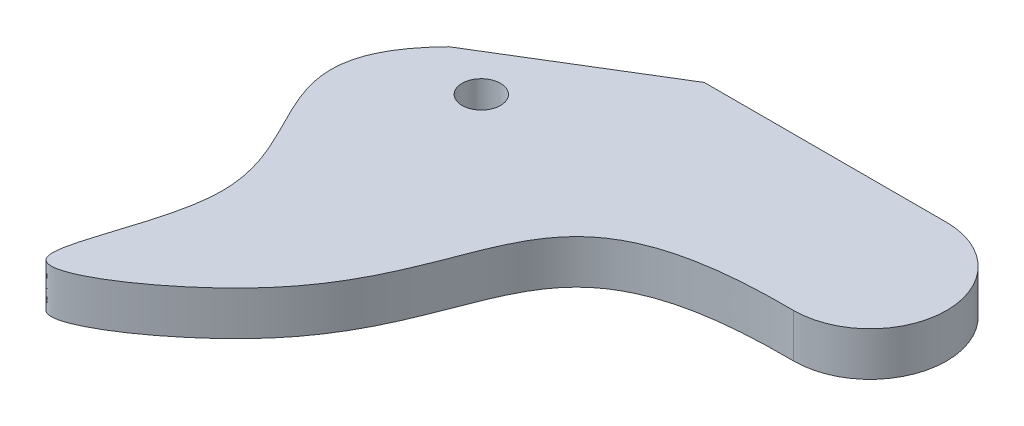
ISO-10303-21;
HEADER;
FILE_DESCRIPTION(('STEP AP214'),'2;1');
FILE_NAME('part.step','',(''),(''),'','','');
FILE_SCHEMA(('AUTOMOTIVE_DESIGN { 1 0 10303 214 1 1 1 1 }'));
ENDSEC;
DATA;
#1=APPLICATION_CONTEXT('core data for automotive mechanical design processes');
#2=APPLICATION_PROTOCOL_DEFINITION('international standard','automotive_design',2000,#1);
#3=PRODUCT_CONTEXT('',#1,'mechanical');
#4=PRODUCT('Part','Part','',(#3));
#5=PRODUCT_RELATED_PRODUCT_CATEGORY('part','',(#4));
#6=PRODUCT_DEFINITION_FORMATION('','',#4);
#7=PRODUCT_DEFINITION_CONTEXT('part definition',#1,'design');
#8=PRODUCT_DEFINITION('design','',#6,#7);
#9=PRODUCT_DEFINITION_SHAPE('','',#8);
#10=(LENGTH_UNIT() NAMED_UNIT(*) SI_UNIT(.MILLI.,.METRE.));
#11=(NAMED_UNIT(*) PLANE_ANGLE_UNIT() SI_UNIT($,.RADIAN.));
#12=(NAMED_UNIT(*) SI_UNIT($,.STERADIAN.) SOLID_ANGLE_UNIT());
#13=UNCERTAINTY_MEASURE_WITH_UNIT(LENGTH_MEASURE(1.E-05),#10,'distance_accuracy_value','');
#14=(GEOMETRIC_REPRESENTATION_CONTEXT(3) GLOBAL_UNCERTAINTY_ASSIGNED_CONTEXT((#13)) GLOBAL_UNIT_ASSIGNED_CONTEXT((#10,
#11,#12)) REPRESENTATION_CONTEXT('',''));
#15=CARTESIAN_POINT('',(0.,0.,0.));
#16=DIRECTION('',(0.,0.,1.));
#17=DIRECTION('',(1.,0.,0.));
#18=AXIS2_PLACEMENT_3D('',#15,#16,#17);
#19=CARTESIAN_POINT('',(-25.8468826698437,4.5,39.8679953100334));
#20=DIRECTION('',(0.,-1.,0.));
#21=DIRECTION('',(0.,0.,-1.));
#22=AXIS2_PLACEMENT_3D('',#19,#20,#21);
#23=PLANE('',#22);
#24=DIRECTION('',(-0.85373785789707,0.,0.52070305356635));
#25=VECTOR('',#24,1.);
#26=CARTESIAN_POINT('',(-13.2289068305966,4.5,-8.03545485670252));
#27=LINE('',#26,#25);
#28=CARTESIAN_POINT('',(-13.2289068305966,4.5,-8.03545485670252));
#29=VERTEX_POINT('',#28);
#30=CARTESIAN_POINT('',(-29.5278018595063,4.5,1.9054003283019));
#31=VERTEX_POINT('',#30);
#32=EDGE_CURVE('E85',#29,#31,#27,.T.);
#33=ORIENTED_EDGE('',*,*,#32,.T.);
#34=CARTESIAN_POINT('',(-29.5278018595063,4.5,1.9054003283019));
#35=CARTESIAN_POINT('',(-39.373883882875,4.5,12.0427063909764));
#36=CARTESIAN_POINT('',(-21.4837938279231,4.5,19.6224952065016));
#37=CARTESIAN_POINT('',(-37.0611534072056,4.5,48.0941578942005));
#38=CARTESIAN_POINT('',(-2.77899188510992,4.5,24.8059677229349));
#39=CARTESIAN_POINT('',(-14.13896958369,4.5,7.37335119843411));
#40=CARTESIAN_POINT('',(11.6530193285,4.5,7.66013429683492));
#41=B_SPLINE_CURVE_WITH_KNOTS('',3,(#34,#35,#36,#37,#38,#39,#40),.UNSPECIFIED.,.F.,.F.,(4,1,1,1,
4),(0.,0.264966168408537,0.418851031726959,0.58712602821493,1.),.UNSPECIFIED.);
#42=CARTESIAN_POINT('',(11.6530193285,4.5,7.66013429683492));
#43=VERTEX_POINT('',#42);
#44=EDGE_CURVE('E80',#31,#43,#41,.T.);
#45=ORIENTED_EDGE('',*,*,#44,.T.);
#46=CARTESIAN_POINT('',(11.6530193285,4.5,-0.1876602799338));
#47=DIRECTION('',(0.,1.,0.));
#48=DIRECTION('',(0.,0.,1.));
#49=AXIS2_PLACEMENT_3D('',#46,#47,#48);
#50=CIRCLE('',#49,7.84779457676872);
#51=CARTESIAN_POINT('',(11.6530193285,4.5,-8.03545485670252));
#52=VERTEX_POINT('',#51);
#53=EDGE_CURVE('E83',#43,#52,#50,.T.);
#54=ORIENTED_EDGE('',*,*,#53,.T.);
#55=DIRECTION('',(-1.,0.,0.));
#56=VECTOR('',#55,1.);
#57=CARTESIAN_POINT('',(-13.2289068305966,4.5,-8.03545485670252));
#58=LINE('',#57,#56);
#59=EDGE_CURVE('E50',#52,#29,#58,.T.);
#60=ORIENTED_EDGE('',*,*,#59,.T.);
#61=EDGE_LOOP('',(#33,#45,#54,#60));
#62=FACE_BOUND('',#61,.T.);
#63=CARTESIAN_POINT('',(-23.6205551146785,4.5,4.47899590226864));
#64=DIRECTION('',(0.,1.,0.));
#65=DIRECTION('',(0.,0.,1.));
#66=AXIS2_PLACEMENT_3D('',#63,#64,#65);
#67=CIRCLE('',#66,1.97500000000001);
#68=CARTESIAN_POINT('',(-23.6205551146785,4.5,6.45399590226865));
#69=VERTEX_POINT('',#68);
#70=EDGE_CURVE('E103',#69,#69,#67,.T.);
#71=ORIENTED_EDGE('',*,*,#70,.F.);
#72=EDGE_LOOP('',(#71));
#73=FACE_BOUND('',#72,.T.);
#74=ADVANCED_FACE('F33',(#62,#73),#23,.F.);
#75=CARTESIAN_POINT('',(-25.8468826698437,0.,39.8679953100334));
#76=DIRECTION('',(0.,-1.,0.));
#77=DIRECTION('',(0.,0.,-1.));
#78=AXIS2_PLACEMENT_3D('',#75,#76,#77);
#79=PLANE('',#78);
#80=DIRECTION('',(-0.85373785789707,0.,0.52070305356635));
#81=VECTOR('',#80,1.);
#82=CARTESIAN_POINT('',(-13.2289068305966,0.,-8.03545485670252));
#83=LINE('',#82,#81);
#84=CARTESIAN_POINT('',(-13.2289068305966,0.,-8.03545485670252));
#85=VERTEX_POINT('',#84);
#86=CARTESIAN_POINT('',(-29.5278018595063,0.,1.9054003283019));
#87=VERTEX_POINT('',#86);
#88=EDGE_CURVE('E100',#85,#87,#83,.T.);
#89=ORIENTED_EDGE('',*,*,#88,.F.);
#90=DIRECTION('',(-1.,0.,0.));
#91=VECTOR('',#90,1.);
#92=CARTESIAN_POINT('',(-13.2289068305966,0.,-8.03545485670252));
#93=LINE('',#92,#91);
#94=CARTESIAN_POINT('',(11.6530193285,0.,-8.03545485670252));
#95=VERTEX_POINT('',#94);
#96=EDGE_CURVE('E73',#95,#85,#93,.T.);
#97=ORIENTED_EDGE('',*,*,#96,.F.);
#98=CARTESIAN_POINT('',(11.6530193285,0.,-0.1876602799338));
#99=DIRECTION('',(0.,1.,0.));
#100=DIRECTION('',(0.,0.,1.));
#101=AXIS2_PLACEMENT_3D('',#98,#99,#100);
#102=CIRCLE('',#101,7.84779457676872);
#103=CARTESIAN_POINT('',(11.6530193285,0.,7.66013429683492));
#104=VERTEX_POINT('',#103);
#105=EDGE_CURVE('E67',#104,#95,#102,.T.);
#106=ORIENTED_EDGE('',*,*,#105,.F.);
#107=CARTESIAN_POINT('',(-29.5278018595063,0.,1.9054003283019));
#108=CARTESIAN_POINT('',(-39.373883882875,0.,12.0427063909764));
#109=CARTESIAN_POINT('',(-21.4837938279231,0.,19.6224952065016));
#110=CARTESIAN_POINT('',(-37.0611534072056,0.,48.0941578942005));
#111=CARTESIAN_POINT('',(-2.77899188510992,0.,24.8059677229349));
#112=CARTESIAN_POINT('',(-14.13896958369,0.,7.37335119843411));
#113=CARTESIAN_POINT('',(11.6530193285,0.,7.66013429683492));
#114=B_SPLINE_CURVE_WITH_KNOTS('',3,(#107,#108,#109,#110,#111,#112,#113),.UNSPECIFIED.,.F.,.F.,
(4,1,1,1,4),(0.,0.264966168408537,0.418851031726959,0.58712602821493,1.),.UNSPECIFIED.);
#115=EDGE_CURVE('E89',#87,#104,#114,.T.);
#116=ORIENTED_EDGE('',*,*,#115,.F.);
#117=EDGE_LOOP('',(#89,#97,#106,#116));
#118=FACE_BOUND('',#117,.T.);
#119=CARTESIAN_POINT('',(-23.6205551146785,0.,4.47899590226864));
#120=DIRECTION('',(0.,1.,0.));
#121=DIRECTION('',(0.,0.,1.));
#122=AXIS2_PLACEMENT_3D('',#119,#120,#121);
#123=CIRCLE('',#122,1.97500000000001);
#124=CARTESIAN_POINT('',(-23.6205551146785,0.,6.45399590226865));
#125=VERTEX_POINT('',#124);
#126=EDGE_CURVE('E120',#125,#125,#123,.T.);
#127=ORIENTED_EDGE('',*,*,#126,.T.);
#128=EDGE_LOOP('',(#127));
#129=FACE_BOUND('',#128,.T.);
#130=ADVANCED_FACE('F116',(#118,#129),#79,.T.);
#131=CARTESIAN_POINT('',(-13.2289068305966,4.5,-8.03545485670252));
#132=DIRECTION('',(0.52070305356635,0.,0.85373785789707));
#133=DIRECTION('',(0.853737857897071,0.,-0.52070305356635));
#134=AXIS2_PLACEMENT_3D('',#131,#132,#133);
#135=PLANE('',#134);
#136=ORIENTED_EDGE('',*,*,#88,.T.);
#137=DIRECTION('',(0.,-1.,0.));
#138=VECTOR('',#137,1.);
#139=CARTESIAN_POINT('',(-29.5278018595063,4.5,1.9054003283019));
#140=LINE('',#139,#138);
#141=EDGE_CURVE('E11',#31,#87,#140,.T.);
#142=ORIENTED_EDGE('',*,*,#141,.F.);
#143=ORIENTED_EDGE('',*,*,#32,.F.);
#144=DIRECTION('',(0.,-1.,0.));
#145=VECTOR('',#144,1.);
#146=CARTESIAN_POINT('',(-13.2289068305966,4.5,-8.03545485670252));
#147=LINE('',#146,#145);
#148=EDGE_CURVE('E93',#29,#85,#147,.T.);
#149=ORIENTED_EDGE('',*,*,#148,.T.);
#150=EDGE_LOOP('',(#136,#142,#143,#149));
#151=FACE_BOUND('',#150,.T.);
#152=ADVANCED_FACE('F35',(#151),#135,.F.);
#153=DIRECTION('',(0.,-1.,0.));
#154=VECTOR('',#153,1.);
#155=SURFACE_OF_LINEAR_EXTRUSION('',#41,#154);
#156=ORIENTED_EDGE('',*,*,#115,.T.);
#157=DIRECTION('',(0.,-1.,0.));
#158=VECTOR('',#157,1.);
#159=CARTESIAN_POINT('',(11.6530193285,4.5,7.66013429683492));
#160=LINE('',#159,#158);
#161=EDGE_CURVE('E42',#43,#104,#160,.T.);
#162=ORIENTED_EDGE('',*,*,#161,.F.);
#163=ORIENTED_EDGE('',*,*,#44,.F.);
#164=ORIENTED_EDGE('',*,*,#141,.T.);
#165=EDGE_LOOP('',(#156,#162,#163,#164));
#166=FACE_BOUND('',#165,.T.);
#167=ADVANCED_FACE('F88',(#166),#155,.F.);
#168=CARTESIAN_POINT('',(11.6530193285,4.5,-0.1876602799338));
#169=DIRECTION('',(0.,-1.,0.));
#170=DIRECTION('',(0.,0.,-1.));
#171=AXIS2_PLACEMENT_3D('',#168,#169,#170);
#172=CYLINDRICAL_SURFACE('',#171,7.84779457676872);
#173=ORIENTED_EDGE('',*,*,#105,.T.);
#174=DIRECTION('',(0.,-1.,0.));
#175=VECTOR('',#174,1.);
#176=CARTESIAN_POINT('',(11.6530193285,4.5,-8.03545485670252));
#177=LINE('',#176,#175);
#178=EDGE_CURVE('E90',#52,#95,#177,.T.);
#179=ORIENTED_EDGE('',*,*,#178,.F.);
#180=ORIENTED_EDGE('',*,*,#53,.F.);
#181=ORIENTED_EDGE('',*,*,#161,.T.);
#182=EDGE_LOOP('',(#173,#179,#180,#181));
#183=FACE_BOUND('',#182,.T.);
#184=ADVANCED_FACE('F91',(#183),#172,.T.);
#185=CARTESIAN_POINT('',(-13.2289068305966,4.5,-8.03545485670252));
#186=DIRECTION('',(0.,0.,1.));
#187=DIRECTION('',(1.,0.,0.));
#188=AXIS2_PLACEMENT_3D('',#185,#186,#187);
#189=PLANE('',#188);
#190=ORIENTED_EDGE('',*,*,#96,.T.);
#191=ORIENTED_EDGE('',*,*,#148,.F.);
#192=ORIENTED_EDGE('',*,*,#59,.F.);
#193=ORIENTED_EDGE('',*,*,#178,.T.);
#194=EDGE_LOOP('',(#190,#191,#192,#193));
#195=FACE_BOUND('',#194,.T.);
#196=ADVANCED_FACE('F113',(#195),#189,.F.);
#197=CARTESIAN_POINT('',(-23.6205551146785,4.5,4.47899590226864));
#198=DIRECTION('',(0.,-1.,0.));
#199=DIRECTION('',(0.,0.,-1.));
#200=AXIS2_PLACEMENT_3D('',#197,#198,#199);
#201=CYLINDRICAL_SURFACE('',#200,1.97500000000001);
#202=ORIENTED_EDGE('',*,*,#70,.T.);
#203=EDGE_LOOP('',(#202));
#204=FACE_BOUND('',#203,.T.);
#205=ORIENTED_EDGE('',*,*,#126,.F.);
#206=EDGE_LOOP('',(#205));
#207=FACE_BOUND('',#206,.T.);
#208=ADVANCED_FACE('F126',(#204,#207),#201,.F.);
#209=CLOSED_SHELL('',(#74,#130,#152,#167,#184,#196,#208));
#210=MANIFOLD_SOLID_BREP('B2',#209);
#211=ADVANCED_BREP_SHAPE_REPRESENTATION('',(#18,#210),#14);
#212=SHAPE_DEFINITION_REPRESENTATION(#9,#211);
ENDSEC;
END-ISO-10303-21;
